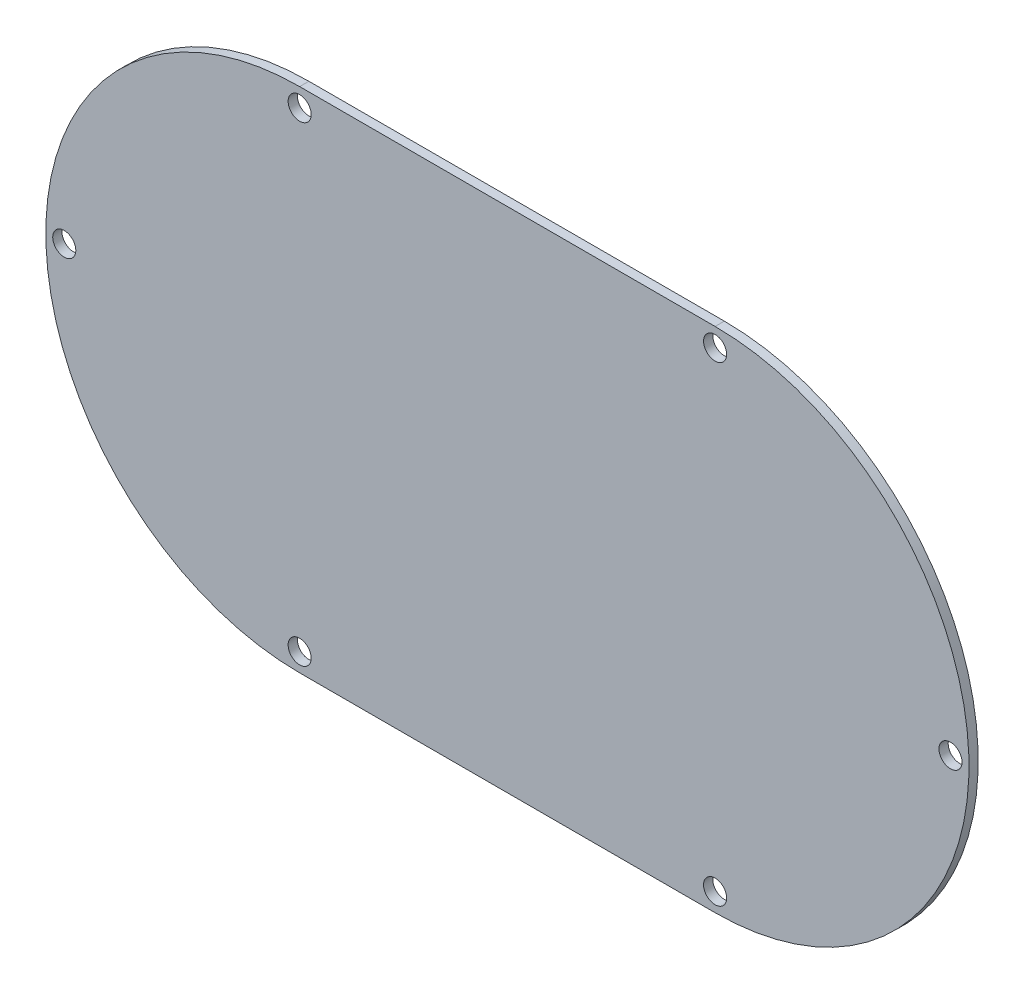
ISO-10303-21;
HEADER;
FILE_DESCRIPTION(('STEP AP214'),'2;1');
FILE_NAME('part.step','',(''),(''),'','','');
FILE_SCHEMA(('AUTOMOTIVE_DESIGN { 1 0 10303 214 1 1 1 1 }'));
ENDSEC;
DATA;
#1=APPLICATION_CONTEXT('core data for automotive mechanical design processes');
#2=APPLICATION_PROTOCOL_DEFINITION('international standard','automotive_design',2000,#1);
#3=PRODUCT_CONTEXT('',#1,'mechanical');
#4=PRODUCT('Part','Part','',(#3));
#5=PRODUCT_RELATED_PRODUCT_CATEGORY('part','',(#4));
#6=PRODUCT_DEFINITION_FORMATION('','',#4);
#7=PRODUCT_DEFINITION_CONTEXT('part definition',#1,'design');
#8=PRODUCT_DEFINITION('design','',#6,#7);
#9=PRODUCT_DEFINITION_SHAPE('','',#8);
#10=(LENGTH_UNIT() NAMED_UNIT(*) SI_UNIT(.MILLI.,.METRE.));
#11=(NAMED_UNIT(*) PLANE_ANGLE_UNIT() SI_UNIT($,.RADIAN.));
#12=(NAMED_UNIT(*) SI_UNIT($,.STERADIAN.) SOLID_ANGLE_UNIT());
#13=UNCERTAINTY_MEASURE_WITH_UNIT(LENGTH_MEASURE(1.E-05),#10,'distance_accuracy_value','');
#14=(GEOMETRIC_REPRESENTATION_CONTEXT(3) GLOBAL_UNCERTAINTY_ASSIGNED_CONTEXT((#13)) GLOBAL_UNIT_ASSIGNED_CONTEXT((#10,
#11,#12)) REPRESENTATION_CONTEXT('',''));
#15=CARTESIAN_POINT('',(0.,0.,0.));
#16=DIRECTION('',(0.,0.,1.));
#17=DIRECTION('',(1.,0.,0.));
#18=AXIS2_PLACEMENT_3D('',#15,#16,#17);
#19=CARTESIAN_POINT('',(0.,0.,2.));
#20=DIRECTION('',(0.,0.,-1.));
#21=DIRECTION('',(-1.,0.,0.));
#22=AXIS2_PLACEMENT_3D('',#19,#20,#21);
#23=CYLINDRICAL_SURFACE('',#22,55.);
#24=CARTESIAN_POINT('',(0.,0.,0.));
#25=DIRECTION('',(0.,0.,1.));
#26=DIRECTION('',(1.,0.,0.));
#27=AXIS2_PLACEMENT_3D('',#24,#25,#26);
#28=CIRCLE('',#27,55.);
#29=CARTESIAN_POINT('',(0.,55.,0.));
#30=VERTEX_POINT('',#29);
#31=CARTESIAN_POINT('',(0.,-55.,0.));
#32=VERTEX_POINT('',#31);
#33=EDGE_CURVE('E93',#30,#32,#28,.T.);
#34=ORIENTED_EDGE('',*,*,#33,.T.);
#35=DIRECTION('',(0.,0.,-1.));
#36=VECTOR('',#35,1.);
#37=CARTESIAN_POINT('',(0.,-55.,2.));
#38=LINE('',#37,#36);
#39=CARTESIAN_POINT('',(0.,-55.,2.));
#40=VERTEX_POINT('',#39);
#41=EDGE_CURVE('E11',#40,#32,#38,.T.);
#42=ORIENTED_EDGE('',*,*,#41,.F.);
#43=CARTESIAN_POINT('',(0.,0.,2.));
#44=DIRECTION('',(0.,0.,1.));
#45=DIRECTION('',(1.,0.,0.));
#46=AXIS2_PLACEMENT_3D('',#43,#44,#45);
#47=CIRCLE('',#46,55.);
#48=CARTESIAN_POINT('',(0.,55.,2.));
#49=VERTEX_POINT('',#48);
#50=EDGE_CURVE('E81',#49,#40,#47,.T.);
#51=ORIENTED_EDGE('',*,*,#50,.F.);
#52=DIRECTION('',(0.,0.,-1.));
#53=VECTOR('',#52,1.);
#54=CARTESIAN_POINT('',(0.,55.,2.));
#55=LINE('',#54,#53);
#56=EDGE_CURVE('E89',#49,#30,#55,.T.);
#57=ORIENTED_EDGE('',*,*,#56,.T.);
#58=EDGE_LOOP('',(#34,#42,#51,#57));
#59=FACE_BOUND('',#58,.T.);
#60=ADVANCED_FACE('F30',(#59),#23,.T.);
#61=CARTESIAN_POINT('',(0.,-55.,2.));
#62=DIRECTION('',(0.,1.,0.));
#63=DIRECTION('',(0.,0.,1.));
#64=AXIS2_PLACEMENT_3D('',#61,#62,#63);
#65=PLANE('',#64);
#66=DIRECTION('',(1.,0.,0.));
#67=VECTOR('',#66,1.);
#68=CARTESIAN_POINT('',(0.,-55.,0.));
#69=LINE('',#68,#67);
#70=CARTESIAN_POINT('',(90.,-55.,0.));
#71=VERTEX_POINT('',#70);
#72=EDGE_CURVE('E85',#32,#71,#69,.T.);
#73=ORIENTED_EDGE('',*,*,#72,.T.);
#74=DIRECTION('',(0.,0.,-1.));
#75=VECTOR('',#74,1.);
#76=CARTESIAN_POINT('',(90.,-55.,2.));
#77=LINE('',#76,#75);
#78=CARTESIAN_POINT('',(90.,-55.,2.));
#79=VERTEX_POINT('',#78);
#80=EDGE_CURVE('E38',#79,#71,#77,.T.);
#81=ORIENTED_EDGE('',*,*,#80,.F.);
#82=DIRECTION('',(1.,0.,0.));
#83=VECTOR('',#82,1.);
#84=CARTESIAN_POINT('',(0.,-55.,2.));
#85=LINE('',#84,#83);
#86=EDGE_CURVE('E76',#40,#79,#85,.T.);
#87=ORIENTED_EDGE('',*,*,#86,.F.);
#88=ORIENTED_EDGE('',*,*,#41,.T.);
#89=EDGE_LOOP('',(#73,#81,#87,#88));
#90=FACE_BOUND('',#89,.T.);
#91=ADVANCED_FACE('F84',(#90),#65,.F.);
#92=CARTESIAN_POINT('',(90.,0.,2.));
#93=DIRECTION('',(0.,0.,-1.));
#94=DIRECTION('',(-1.,0.,0.));
#95=AXIS2_PLACEMENT_3D('',#92,#93,#94);
#96=CYLINDRICAL_SURFACE('',#95,55.);
#97=CARTESIAN_POINT('',(90.,0.,0.));
#98=DIRECTION('',(0.,0.,1.));
#99=DIRECTION('',(1.,0.,0.));
#100=AXIS2_PLACEMENT_3D('',#97,#98,#99);
#101=CIRCLE('',#100,55.);
#102=CARTESIAN_POINT('',(90.,55.,0.));
#103=VERTEX_POINT('',#102);
#104=EDGE_CURVE('E63',#71,#103,#101,.T.);
#105=ORIENTED_EDGE('',*,*,#104,.T.);
#106=DIRECTION('',(0.,0.,-1.));
#107=VECTOR('',#106,1.);
#108=CARTESIAN_POINT('',(90.,55.,2.));
#109=LINE('',#108,#107);
#110=CARTESIAN_POINT('',(90.,55.,2.));
#111=VERTEX_POINT('',#110);
#112=EDGE_CURVE('E86',#111,#103,#109,.T.);
#113=ORIENTED_EDGE('',*,*,#112,.F.);
#114=CARTESIAN_POINT('',(90.,0.,2.));
#115=DIRECTION('',(0.,0.,1.));
#116=DIRECTION('',(1.,0.,0.));
#117=AXIS2_PLACEMENT_3D('',#114,#115,#116);
#118=CIRCLE('',#117,55.);
#119=EDGE_CURVE('E79',#79,#111,#118,.T.);
#120=ORIENTED_EDGE('',*,*,#119,.F.);
#121=ORIENTED_EDGE('',*,*,#80,.T.);
#122=EDGE_LOOP('',(#105,#113,#120,#121));
#123=FACE_BOUND('',#122,.T.);
#124=ADVANCED_FACE('F87',(#123),#96,.T.);
#125=CARTESIAN_POINT('',(0.,55.,2.));
#126=DIRECTION('',(0.,-1.,0.));
#127=DIRECTION('',(0.,0.,-1.));
#128=AXIS2_PLACEMENT_3D('',#125,#126,#127);
#129=PLANE('',#128);
#130=DIRECTION('',(-1.,0.,0.));
#131=VECTOR('',#130,1.);
#132=CARTESIAN_POINT('',(0.,55.,0.));
#133=LINE('',#132,#131);
#134=EDGE_CURVE('E69',#103,#30,#133,.T.);
#135=ORIENTED_EDGE('',*,*,#134,.T.);
#136=ORIENTED_EDGE('',*,*,#56,.F.);
#137=DIRECTION('',(-1.,0.,0.));
#138=VECTOR('',#137,1.);
#139=CARTESIAN_POINT('',(0.,55.,2.));
#140=LINE('',#139,#138);
#141=EDGE_CURVE('E46',#111,#49,#140,.T.);
#142=ORIENTED_EDGE('',*,*,#141,.F.);
#143=ORIENTED_EDGE('',*,*,#112,.T.);
#144=EDGE_LOOP('',(#135,#136,#142,#143));
#145=FACE_BOUND('',#144,.T.);
#146=ADVANCED_FACE('F101',(#145),#129,.F.);
#147=CARTESIAN_POINT('',(0.,0.,2.));
#148=DIRECTION('',(0.,0.,1.));
#149=DIRECTION('',(1.,0.,0.));
#150=AXIS2_PLACEMENT_3D('',#147,#148,#149);
#151=PLANE('',#150);
#152=CARTESIAN_POINT('',(140.999999999999,1.9592249372348E-12,2.));
#153=DIRECTION('',(0.,0.,1.));
#154=DIRECTION('',(1.,0.,0.));
#155=AXIS2_PLACEMENT_3D('',#152,#153,#154);
#156=CIRCLE('',#155,2.5);
#157=CARTESIAN_POINT('',(143.499999999999,1.9592249372348E-12,2.));
#158=VERTEX_POINT('',#157);
#159=EDGE_CURVE('E136',#158,#158,#156,.T.);
#160=ORIENTED_EDGE('',*,*,#159,.F.);
#161=EDGE_LOOP('',(#160));
#162=FACE_BOUND('',#161,.T.);
#163=CARTESIAN_POINT('',(90.,-50.9999999999979,2.));
#164=DIRECTION('',(0.,0.,1.));
#165=DIRECTION('',(1.,0.,0.));
#166=AXIS2_PLACEMENT_3D('',#163,#164,#165);
#167=CIRCLE('',#166,2.49999999999649);
#168=CARTESIAN_POINT('',(92.4999999999965,-50.9999999999979,2.));
#169=VERTEX_POINT('',#168);
#170=EDGE_CURVE('E130',#169,#169,#167,.T.);
#171=ORIENTED_EDGE('',*,*,#170,.F.);
#172=EDGE_LOOP('',(#171));
#173=FACE_BOUND('',#172,.T.);
#174=CARTESIAN_POINT('',(0.,-50.9999999999982,2.));
#175=DIRECTION('',(0.,0.,1.));
#176=DIRECTION('',(1.,0.,0.));
#177=AXIS2_PLACEMENT_3D('',#174,#175,#176);
#178=CIRCLE('',#177,2.49999999999825);
#179=CARTESIAN_POINT('',(2.49999999999826,-50.9999999999982,2.));
#180=VERTEX_POINT('',#179);
#181=EDGE_CURVE('E124',#180,#180,#178,.T.);
#182=ORIENTED_EDGE('',*,*,#181,.F.);
#183=EDGE_LOOP('',(#182));
#184=FACE_BOUND('',#183,.T.);
#185=CARTESIAN_POINT('',(-50.9999999999994,1.33214272945992E-12,2.));
#186=DIRECTION('',(0.,0.,1.));
#187=DIRECTION('',(1.,0.,0.));
#188=AXIS2_PLACEMENT_3D('',#185,#186,#187);
#189=CIRCLE('',#188,2.5);
#190=CARTESIAN_POINT('',(-48.4999999999994,1.33214272945992E-12,2.));
#191=VERTEX_POINT('',#190);
#192=EDGE_CURVE('E118',#191,#191,#189,.T.);
#193=ORIENTED_EDGE('',*,*,#192,.F.);
#194=EDGE_LOOP('',(#193));
#195=FACE_BOUND('',#194,.T.);
#196=CARTESIAN_POINT('',(0.,51.0000000000008,2.));
#197=DIRECTION('',(0.,0.,1.));
#198=DIRECTION('',(1.,0.,0.));
#199=AXIS2_PLACEMENT_3D('',#196,#197,#198);
#200=CIRCLE('',#199,2.5);
#201=CARTESIAN_POINT('',(2.50000000000006,51.0000000000008,2.));
#202=VERTEX_POINT('',#201);
#203=EDGE_CURVE('E112',#202,#202,#200,.T.);
#204=ORIENTED_EDGE('',*,*,#203,.F.);
#205=EDGE_LOOP('',(#204));
#206=FACE_BOUND('',#205,.T.);
#207=CARTESIAN_POINT('',(90.0000000000001,50.9999999999999,2.));
#208=DIRECTION('',(0.,0.,1.));
#209=DIRECTION('',(1.,0.,0.));
#210=AXIS2_PLACEMENT_3D('',#207,#208,#209);
#211=CIRCLE('',#210,2.50000000000001);
#212=CARTESIAN_POINT('',(92.5000000000001,50.9999999999999,2.));
#213=VERTEX_POINT('',#212);
#214=EDGE_CURVE('E96',#213,#213,#211,.T.);
#215=ORIENTED_EDGE('',*,*,#214,.F.);
#216=EDGE_LOOP('',(#215));
#217=FACE_BOUND('',#216,.T.);
#218=ORIENTED_EDGE('',*,*,#50,.T.);
#219=ORIENTED_EDGE('',*,*,#86,.T.);
#220=ORIENTED_EDGE('',*,*,#119,.T.);
#221=ORIENTED_EDGE('',*,*,#141,.T.);
#222=EDGE_LOOP('',(#218,#219,#220,#221));
#223=FACE_BOUND('',#222,.T.);
#224=ADVANCED_FACE('F77',(#162,#173,#184,#195,#206,#217,#223),#151,.T.);
#225=CARTESIAN_POINT('',(0.,0.,0.));
#226=DIRECTION('',(0.,0.,1.));
#227=DIRECTION('',(1.,0.,0.));
#228=AXIS2_PLACEMENT_3D('',#225,#226,#227);
#229=PLANE('',#228);
#230=CARTESIAN_POINT('',(140.999999999999,1.95934983732507E-12,0.));
#231=DIRECTION('',(0.,0.,-1.));
#232=DIRECTION('',(-1.,0.,0.));
#233=AXIS2_PLACEMENT_3D('',#230,#231,#232);
#234=CIRCLE('',#233,2.5);
#235=CARTESIAN_POINT('',(138.499999999999,1.95934983732507E-12,0.));
#236=VERTEX_POINT('',#235);
#237=EDGE_CURVE('E139',#236,#236,#234,.T.);
#238=ORIENTED_EDGE('',*,*,#237,.F.);
#239=EDGE_LOOP('',(#238));
#240=FACE_BOUND('',#239,.T.);
#241=CARTESIAN_POINT('',(90.,-50.9999999999979,0.));
#242=DIRECTION('',(0.,0.,-1.));
#243=DIRECTION('',(1.,0.,0.));
#244=AXIS2_PLACEMENT_3D('',#241,#242,#243);
#245=CIRCLE('',#244,2.49999999999649);
#246=CARTESIAN_POINT('',(92.4999999999965,-50.9999999999979,0.));
#247=VERTEX_POINT('',#246);
#248=EDGE_CURVE('E133',#247,#247,#245,.T.);
#249=ORIENTED_EDGE('',*,*,#248,.F.);
#250=EDGE_LOOP('',(#249));
#251=FACE_BOUND('',#250,.T.);
#252=CARTESIAN_POINT('',(0.,-50.9999999999982,0.));
#253=DIRECTION('',(0.,0.,-1.));
#254=DIRECTION('',(1.,0.,0.));
#255=AXIS2_PLACEMENT_3D('',#252,#253,#254);
#256=CIRCLE('',#255,2.49999999999825);
#257=CARTESIAN_POINT('',(2.49999999999826,-50.9999999999982,0.));
#258=VERTEX_POINT('',#257);
#259=EDGE_CURVE('E127',#258,#258,#256,.T.);
#260=ORIENTED_EDGE('',*,*,#259,.F.);
#261=EDGE_LOOP('',(#260));
#262=FACE_BOUND('',#261,.T.);
#263=CARTESIAN_POINT('',(-50.9999999999994,1.33226762955019E-12,0.));
#264=DIRECTION('',(0.,0.,-1.));
#265=DIRECTION('',(-1.,0.,0.));
#266=AXIS2_PLACEMENT_3D('',#263,#264,#265);
#267=CIRCLE('',#266,2.5);
#268=CARTESIAN_POINT('',(-53.4999999999994,1.33226762955019E-12,0.));
#269=VERTEX_POINT('',#268);
#270=EDGE_CURVE('E121',#269,#269,#267,.T.);
#271=ORIENTED_EDGE('',*,*,#270,.F.);
#272=EDGE_LOOP('',(#271));
#273=FACE_BOUND('',#272,.T.);
#274=CARTESIAN_POINT('',(0.,51.0000000000008,0.));
#275=DIRECTION('',(0.,0.,-1.));
#276=DIRECTION('',(-1.,0.,0.));
#277=AXIS2_PLACEMENT_3D('',#274,#275,#276);
#278=CIRCLE('',#277,2.5);
#279=CARTESIAN_POINT('',(-2.49999999999994,51.0000000000008,0.));
#280=VERTEX_POINT('',#279);
#281=EDGE_CURVE('E115',#280,#280,#278,.T.);
#282=ORIENTED_EDGE('',*,*,#281,.F.);
#283=EDGE_LOOP('',(#282));
#284=FACE_BOUND('',#283,.T.);
#285=CARTESIAN_POINT('',(90.0000000000001,50.9999999999999,0.));
#286=DIRECTION('',(0.,0.,-1.));
#287=DIRECTION('',(-1.,0.,0.));
#288=AXIS2_PLACEMENT_3D('',#285,#286,#287);
#289=CIRCLE('',#288,2.50000000000001);
#290=CARTESIAN_POINT('',(87.5000000000001,50.9999999999999,0.));
#291=VERTEX_POINT('',#290);
#292=EDGE_CURVE('E109',#291,#291,#289,.T.);
#293=ORIENTED_EDGE('',*,*,#292,.F.);
#294=EDGE_LOOP('',(#293));
#295=FACE_BOUND('',#294,.T.);
#296=ORIENTED_EDGE('',*,*,#33,.F.);
#297=ORIENTED_EDGE('',*,*,#134,.F.);
#298=ORIENTED_EDGE('',*,*,#104,.F.);
#299=ORIENTED_EDGE('',*,*,#72,.F.);
#300=EDGE_LOOP('',(#296,#297,#298,#299));
#301=FACE_BOUND('',#300,.T.);
#302=ADVANCED_FACE('F104',(#240,#251,#262,#273,#284,#295,#301),#229,.F.);
#303=CARTESIAN_POINT('',(90.0000000000001,50.9999999999999,10.0000000000001));
#304=DIRECTION('',(0.,0.,-1.));
#305=DIRECTION('',(-1.,0.,0.));
#306=AXIS2_PLACEMENT_3D('',#303,#304,#305);
#307=CYLINDRICAL_SURFACE('',#306,2.50000000000001);
#308=ORIENTED_EDGE('',*,*,#214,.T.);
#309=EDGE_LOOP('',(#308));
#310=FACE_BOUND('',#309,.T.);
#311=ORIENTED_EDGE('',*,*,#292,.T.);
#312=EDGE_LOOP('',(#311));
#313=FACE_BOUND('',#312,.T.);
#314=ADVANCED_FACE('F147',(#310,#313),#307,.F.);
#315=CARTESIAN_POINT('',(0.,51.0000000000008,10.));
#316=DIRECTION('',(0.,0.,-1.));
#317=DIRECTION('',(-1.,0.,0.));
#318=AXIS2_PLACEMENT_3D('',#315,#316,#317);
#319=CYLINDRICAL_SURFACE('',#318,2.5);
#320=ORIENTED_EDGE('',*,*,#203,.T.);
#321=EDGE_LOOP('',(#320));
#322=FACE_BOUND('',#321,.T.);
#323=ORIENTED_EDGE('',*,*,#281,.T.);
#324=EDGE_LOOP('',(#323));
#325=FACE_BOUND('',#324,.T.);
#326=ADVANCED_FACE('F160',(#322,#325),#319,.F.);
#327=CARTESIAN_POINT('',(-50.9999999999994,1.33164312909884E-12,9.99999999999997));
#328=DIRECTION('',(0.,0.,-1.));
#329=DIRECTION('',(-1.,0.,0.));
#330=AXIS2_PLACEMENT_3D('',#327,#328,#329);
#331=CYLINDRICAL_SURFACE('',#330,2.5);
#332=ORIENTED_EDGE('',*,*,#192,.T.);
#333=EDGE_LOOP('',(#332));
#334=FACE_BOUND('',#333,.T.);
#335=ORIENTED_EDGE('',*,*,#270,.T.);
#336=EDGE_LOOP('',(#335));
#337=FACE_BOUND('',#336,.T.);
#338=ADVANCED_FACE('F166',(#334,#337),#331,.F.);
#339=CARTESIAN_POINT('',(0.,-50.9999999999982,10.));
#340=DIRECTION('',(0.,0.,-1.));
#341=DIRECTION('',(-1.,0.,0.));
#342=AXIS2_PLACEMENT_3D('',#339,#340,#341);
#343=CYLINDRICAL_SURFACE('',#342,2.49999999999825);
#344=ORIENTED_EDGE('',*,*,#181,.T.);
#345=EDGE_LOOP('',(#344));
#346=FACE_BOUND('',#345,.T.);
#347=ORIENTED_EDGE('',*,*,#259,.T.);
#348=EDGE_LOOP('',(#347));
#349=FACE_BOUND('',#348,.T.);
#350=ADVANCED_FACE('F199',(#346,#349),#343,.F.);
#351=CARTESIAN_POINT('',(90.,-50.9999999999979,10.0000000000001));
#352=DIRECTION('',(0.,0.,-1.));
#353=DIRECTION('',(-1.,0.,0.));
#354=AXIS2_PLACEMENT_3D('',#351,#352,#353);
#355=CYLINDRICAL_SURFACE('',#354,2.49999999999649);
#356=ORIENTED_EDGE('',*,*,#170,.T.);
#357=EDGE_LOOP('',(#356));
#358=FACE_BOUND('',#357,.T.);
#359=ORIENTED_EDGE('',*,*,#248,.T.);
#360=EDGE_LOOP('',(#359));
#361=FACE_BOUND('',#360,.T.);
#362=ADVANCED_FACE('F204',(#358,#361),#355,.F.);
#363=CARTESIAN_POINT('',(140.999999999999,1.95872533687372E-12,10.0000000000001));
#364=DIRECTION('',(0.,0.,-1.));
#365=DIRECTION('',(-1.,0.,0.));
#366=AXIS2_PLACEMENT_3D('',#363,#364,#365);
#367=CYLINDRICAL_SURFACE('',#366,2.5);
#368=ORIENTED_EDGE('',*,*,#159,.T.);
#369=EDGE_LOOP('',(#368));
#370=FACE_BOUND('',#369,.T.);
#371=ORIENTED_EDGE('',*,*,#237,.T.);
#372=EDGE_LOOP('',(#371));
#373=FACE_BOUND('',#372,.T.);
#374=ADVANCED_FACE('F143',(#370,#373),#367,.F.);
#375=CLOSED_SHELL('',(#60,#91,#124,#146,#224,#302,#314,#326,#338,#350,#362,#374));
#376=MANIFOLD_SOLID_BREP('B2',#375);
#377=ADVANCED_BREP_SHAPE_REPRESENTATION('',(#18,#376),#14);
#378=SHAPE_DEFINITION_REPRESENTATION(#9,#377);
ENDSEC;
END-ISO-10303-21;
